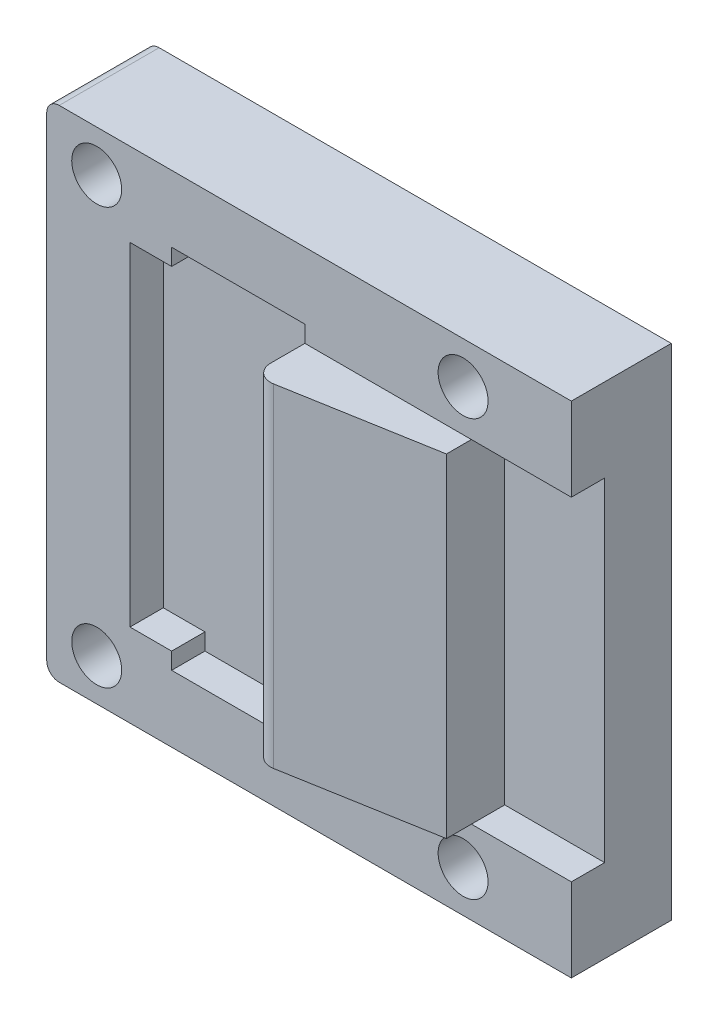
ISO-10303-21;
HEADER;
FILE_DESCRIPTION(('STEP AP214'),'2;1');
FILE_NAME('part.step','',(''),(''),'','','');
FILE_SCHEMA(('AUTOMOTIVE_DESIGN { 1 0 10303 214 1 1 1 1 }'));
ENDSEC;
DATA;
#1=APPLICATION_CONTEXT('core data for automotive mechanical design processes');
#2=APPLICATION_PROTOCOL_DEFINITION('international standard','automotive_design',2000,#1);
#3=PRODUCT_CONTEXT('',#1,'mechanical');
#4=PRODUCT('Part','Part','',(#3));
#5=PRODUCT_RELATED_PRODUCT_CATEGORY('part','',(#4));
#6=PRODUCT_DEFINITION_FORMATION('','',#4);
#7=PRODUCT_DEFINITION_CONTEXT('part definition',#1,'design');
#8=PRODUCT_DEFINITION('design','',#6,#7);
#9=PRODUCT_DEFINITION_SHAPE('','',#8);
#10=(LENGTH_UNIT() NAMED_UNIT(*) SI_UNIT(.MILLI.,.METRE.));
#11=(NAMED_UNIT(*) PLANE_ANGLE_UNIT() SI_UNIT($,.RADIAN.));
#12=(NAMED_UNIT(*) SI_UNIT($,.STERADIAN.) SOLID_ANGLE_UNIT());
#13=UNCERTAINTY_MEASURE_WITH_UNIT(LENGTH_MEASURE(1.E-05),#10,'distance_accuracy_value','');
#14=(GEOMETRIC_REPRESENTATION_CONTEXT(3) GLOBAL_UNCERTAINTY_ASSIGNED_CONTEXT((#13)) GLOBAL_UNIT_ASSIGNED_CONTEXT((#10,
#11,#12)) REPRESENTATION_CONTEXT('',''));
#15=CARTESIAN_POINT('',(0.,0.,0.));
#16=DIRECTION('',(0.,0.,1.));
#17=DIRECTION('',(1.,0.,0.));
#18=AXIS2_PLACEMENT_3D('',#15,#16,#17);
#19=CARTESIAN_POINT('',(-19.25,-14.25,6.));
#20=DIRECTION('',(0.,0.,1.));
#21=DIRECTION('',(0.,-1.,0.));
#22=AXIS2_PLACEMENT_3D('',#19,#20,#21);
#23=CYLINDRICAL_SURFACE('',#22,0.75);
#24=DIRECTION('',(0.,0.,1.));
#25=VECTOR('',#24,1.);
#26=CARTESIAN_POINT('',(-20.,-14.25,6.));
#27=LINE('',#26,#25);
#28=CARTESIAN_POINT('',(-20.,-14.25,0.));
#29=VERTEX_POINT('',#28);
#30=CARTESIAN_POINT('',(-20.,-14.25,6.));
#31=VERTEX_POINT('',#30);
#32=EDGE_CURVE('E265',#29,#31,#27,.T.);
#33=ORIENTED_EDGE('',*,*,#32,.F.);
#34=CARTESIAN_POINT('',(-19.25,-14.25,0.));
#35=DIRECTION('',(0.,0.,1.));
#36=DIRECTION('',(1.,0.,0.));
#37=AXIS2_PLACEMENT_3D('',#34,#35,#36);
#38=CIRCLE('',#37,0.75);
#39=CARTESIAN_POINT('',(-19.25,-15.,0.));
#40=VERTEX_POINT('',#39);
#41=EDGE_CURVE('E271',#40,#29,#38,.F.);
#42=ORIENTED_EDGE('',*,*,#41,.F.);
#43=DIRECTION('',(0.,0.,1.));
#44=VECTOR('',#43,1.);
#45=CARTESIAN_POINT('',(-19.25,-15.,6.));
#46=LINE('',#45,#44);
#47=CARTESIAN_POINT('',(-19.25,-15.,6.));
#48=VERTEX_POINT('',#47);
#49=EDGE_CURVE('E268',#48,#40,#46,.F.);
#50=ORIENTED_EDGE('',*,*,#49,.F.);
#51=CARTESIAN_POINT('',(-19.25,-14.25,6.));
#52=DIRECTION('',(0.,0.,-1.));
#53=DIRECTION('',(0.,1.,0.));
#54=AXIS2_PLACEMENT_3D('',#51,#52,#53);
#55=CIRCLE('',#54,0.75);
#56=EDGE_CURVE('E41',#31,#48,#55,.F.);
#57=ORIENTED_EDGE('',*,*,#56,.F.);
#58=EDGE_LOOP('',(#33,#42,#50,#57));
#59=FACE_BOUND('',#58,.T.);
#60=ADVANCED_FACE('F34',(#59),#23,.T.);
#61=CARTESIAN_POINT('',(-19.25,14.25,6.));
#62=DIRECTION('',(0.,0.,1.));
#63=DIRECTION('',(0.,-1.,0.));
#64=AXIS2_PLACEMENT_3D('',#61,#62,#63);
#65=CYLINDRICAL_SURFACE('',#64,0.75);
#66=DIRECTION('',(0.,0.,1.));
#67=VECTOR('',#66,1.);
#68=CARTESIAN_POINT('',(-19.25,15.,6.));
#69=LINE('',#68,#67);
#70=CARTESIAN_POINT('',(-19.25,15.,0.));
#71=VERTEX_POINT('',#70);
#72=CARTESIAN_POINT('',(-19.25,15.,6.));
#73=VERTEX_POINT('',#72);
#74=EDGE_CURVE('E256',#71,#73,#69,.T.);
#75=ORIENTED_EDGE('',*,*,#74,.F.);
#76=CARTESIAN_POINT('',(-19.25,14.25,0.));
#77=DIRECTION('',(0.,0.,1.));
#78=DIRECTION('',(1.,0.,0.));
#79=AXIS2_PLACEMENT_3D('',#76,#77,#78);
#80=CIRCLE('',#79,0.75);
#81=CARTESIAN_POINT('',(-20.,14.25,0.));
#82=VERTEX_POINT('',#81);
#83=EDGE_CURVE('E227',#82,#71,#80,.F.);
#84=ORIENTED_EDGE('',*,*,#83,.F.);
#85=DIRECTION('',(0.,0.,1.));
#86=VECTOR('',#85,1.);
#87=CARTESIAN_POINT('',(-20.,14.25,6.));
#88=LINE('',#87,#86);
#89=CARTESIAN_POINT('',(-20.,14.25,6.));
#90=VERTEX_POINT('',#89);
#91=EDGE_CURVE('E258',#90,#82,#88,.F.);
#92=ORIENTED_EDGE('',*,*,#91,.F.);
#93=CARTESIAN_POINT('',(-19.25,14.25,6.));
#94=DIRECTION('',(0.,0.,-1.));
#95=DIRECTION('',(0.,1.,0.));
#96=AXIS2_PLACEMENT_3D('',#93,#94,#95);
#97=CIRCLE('',#96,0.75);
#98=EDGE_CURVE('E262',#73,#90,#97,.F.);
#99=ORIENTED_EDGE('',*,*,#98,.F.);
#100=EDGE_LOOP('',(#75,#84,#92,#99));
#101=FACE_BOUND('',#100,.T.);
#102=ADVANCED_FACE('F429',(#101),#65,.T.);
#103=CARTESIAN_POINT('',(-3.5,-20.1519702521235,8.05980297478765));
#104=DIRECTION('',(0.,1.,0.));
#105=DIRECTION('',(0.,0.,1.));
#106=AXIS2_PLACEMENT_3D('',#103,#104,#105);
#107=CYLINDRICAL_SURFACE('',#106,1.);
#108=DIRECTION('',(0.,-1.,0.));
#109=VECTOR('',#108,1.);
#110=CARTESIAN_POINT('',(-3.32761966824775,-20.1519702521235,9.04483344194336));
#111=LINE('',#110,#109);
#112=CARTESIAN_POINT('',(-3.32761966824775,10.,9.04483344194336));
#113=VERTEX_POINT('',#112);
#114=CARTESIAN_POINT('',(-3.32761966824775,-10.,9.04483344194336));
#115=VERTEX_POINT('',#114);
#116=EDGE_CURVE('E242',#113,#115,#111,.T.);
#117=ORIENTED_EDGE('',*,*,#116,.F.);
#118=CARTESIAN_POINT('',(-3.5,10.,8.05980297478765));
#119=DIRECTION('',(0.,-1.,0.));
#120=DIRECTION('',(0.,0.,-1.));
#121=AXIS2_PLACEMENT_3D('',#118,#119,#120);
#122=CIRCLE('',#121,1.);
#123=CARTESIAN_POINT('',(-4.5,10.,8.05980297478765));
#124=VERTEX_POINT('',#123);
#125=EDGE_CURVE('E252',#124,#113,#122,.F.);
#126=ORIENTED_EDGE('',*,*,#125,.F.);
#127=DIRECTION('',(0.,-1.,0.));
#128=VECTOR('',#127,1.);
#129=CARTESIAN_POINT('',(-4.5,-20.1519702521235,8.05980297478765));
#130=LINE('',#129,#128);
#131=CARTESIAN_POINT('',(-4.5,-10.,8.05980297478765));
#132=VERTEX_POINT('',#131);
#133=EDGE_CURVE('E249',#132,#124,#130,.F.);
#134=ORIENTED_EDGE('',*,*,#133,.F.);
#135=CARTESIAN_POINT('',(-3.5,-10.,8.05980297478765));
#136=DIRECTION('',(0.,1.,0.));
#137=DIRECTION('',(-1.,0.,0.));
#138=AXIS2_PLACEMENT_3D('',#135,#136,#137);
#139=CIRCLE('',#138,1.);
#140=EDGE_CURVE('E254',#115,#132,#139,.F.);
#141=ORIENTED_EDGE('',*,*,#140,.F.);
#142=EDGE_LOOP('',(#117,#126,#134,#141));
#143=FACE_BOUND('',#142,.T.);
#144=ADVANCED_FACE('F462',(#143),#107,.T.);
#145=CARTESIAN_POINT('',(15.,-10.,6.));
#146=DIRECTION('',(0.,1.,0.));
#147=DIRECTION('',(-1.,0.,0.));
#148=AXIS2_PLACEMENT_3D('',#145,#146,#147);
#149=PLANE('',#148);
#150=DIRECTION('',(0.,0.,1.));
#151=VECTOR('',#150,1.);
#152=CARTESIAN_POINT('',(-12.5,-10.,6.));
#153=LINE('',#152,#151);
#154=CARTESIAN_POINT('',(-12.5,-10.,4.));
#155=VERTEX_POINT('',#154);
#156=CARTESIAN_POINT('',(-12.5,-10.,6.));
#157=VERTEX_POINT('',#156);
#158=EDGE_CURVE('E346',#155,#157,#153,.T.);
#159=ORIENTED_EDGE('',*,*,#158,.F.);
#160=DIRECTION('',(1.,0.,0.));
#161=VECTOR('',#160,1.);
#162=CARTESIAN_POINT('',(-15.,-10.,4.));
#163=LINE('',#162,#161);
#164=CARTESIAN_POINT('',(-15.,-10.,4.));
#165=VERTEX_POINT('',#164);
#166=EDGE_CURVE('E388',#165,#155,#163,.T.);
#167=ORIENTED_EDGE('',*,*,#166,.F.);
#168=DIRECTION('',(0.,0.,-1.));
#169=VECTOR('',#168,1.);
#170=CARTESIAN_POINT('',(-15.,-10.,6.));
#171=LINE('',#170,#169);
#172=CARTESIAN_POINT('',(-15.,-10.,6.));
#173=VERTEX_POINT('',#172);
#174=EDGE_CURVE('E239',#173,#165,#171,.T.);
#175=ORIENTED_EDGE('',*,*,#174,.F.);
#176=DIRECTION('',(1.,0.,0.));
#177=VECTOR('',#176,1.);
#178=CARTESIAN_POINT('',(15.,-10.,6.));
#179=LINE('',#178,#177);
#180=EDGE_CURVE('E246',#173,#157,#179,.T.);
#181=ORIENTED_EDGE('',*,*,#180,.T.);
#182=EDGE_LOOP('',(#159,#167,#175,#181));
#183=FACE_BOUND('',#182,.T.);
#184=ADVANCED_FACE('F481',(#183),#149,.T.);
#185=DIRECTION('',(0.,0.,1.));
#186=VECTOR('',#185,1.);
#187=CARTESIAN_POINT('',(11.5,-10.,6.));
#188=LINE('',#187,#186);
#189=CARTESIAN_POINT('',(11.5,-10.,4.));
#190=VERTEX_POINT('',#189);
#191=CARTESIAN_POINT('',(11.5,-10.,6.));
#192=VERTEX_POINT('',#191);
#193=EDGE_CURVE('E434',#190,#192,#188,.T.);
#194=ORIENTED_EDGE('',*,*,#193,.F.);
#195=DIRECTION('',(1.,0.,0.));
#196=VECTOR('',#195,1.);
#197=CARTESIAN_POINT('',(5.5,-10.,4.));
#198=LINE('',#197,#196);
#199=CARTESIAN_POINT('',(5.5,-10.,4.));
#200=VERTEX_POINT('',#199);
#201=EDGE_CURVE('E378',#200,#190,#198,.T.);
#202=ORIENTED_EDGE('',*,*,#201,.F.);
#203=DIRECTION('',(0.,0.,-1.));
#204=VECTOR('',#203,1.);
#205=CARTESIAN_POINT('',(5.5,-10.,31.3606797749979));
#206=LINE('',#205,#204);
#207=CARTESIAN_POINT('',(5.5,-10.,6.));
#208=VERTEX_POINT('',#207);
#209=EDGE_CURVE('E387',#208,#200,#206,.T.);
#210=ORIENTED_EDGE('',*,*,#209,.F.);
#211=EDGE_CURVE('E419',#208,#192,#179,.T.);
#212=ORIENTED_EDGE('',*,*,#211,.T.);
#213=EDGE_LOOP('',(#194,#202,#210,#212));
#214=FACE_BOUND('',#213,.T.);
#215=ADVANCED_FACE('F443',(#214),#149,.T.);
#216=CARTESIAN_POINT('',(15.,10.,6.));
#217=DIRECTION('',(0.,-1.,0.));
#218=DIRECTION('',(1.,0.,0.));
#219=AXIS2_PLACEMENT_3D('',#216,#217,#218);
#220=PLANE('',#219);
#221=DIRECTION('',(0.,0.,-1.));
#222=VECTOR('',#221,1.);
#223=CARTESIAN_POINT('',(-12.5,9.99999999999999,6.));
#224=LINE('',#223,#222);
#225=CARTESIAN_POINT('',(-12.5,9.99999999999999,6.));
#226=VERTEX_POINT('',#225);
#227=CARTESIAN_POINT('',(-12.5,10.,4.));
#228=VERTEX_POINT('',#227);
#229=EDGE_CURVE('E344',#226,#228,#224,.T.);
#230=ORIENTED_EDGE('',*,*,#229,.F.);
#231=DIRECTION('',(-1.,0.,0.));
#232=VECTOR('',#231,1.);
#233=CARTESIAN_POINT('',(15.,10.,6.));
#234=LINE('',#233,#232);
#235=CARTESIAN_POINT('',(-15.,9.99999999999999,6.));
#236=VERTEX_POINT('',#235);
#237=EDGE_CURVE('E412',#226,#236,#234,.T.);
#238=ORIENTED_EDGE('',*,*,#237,.T.);
#239=DIRECTION('',(0.,0.,-1.));
#240=VECTOR('',#239,1.);
#241=CARTESIAN_POINT('',(-15.,9.99999999999999,6.));
#242=LINE('',#241,#240);
#243=CARTESIAN_POINT('',(-15.,10.,4.));
#244=VERTEX_POINT('',#243);
#245=EDGE_CURVE('E243',#236,#244,#242,.T.);
#246=ORIENTED_EDGE('',*,*,#245,.T.);
#247=DIRECTION('',(-1.,0.,0.));
#248=VECTOR('',#247,1.);
#249=CARTESIAN_POINT('',(-15.,10.,4.));
#250=LINE('',#249,#248);
#251=EDGE_CURVE('E381',#228,#244,#250,.T.);
#252=ORIENTED_EDGE('',*,*,#251,.F.);
#253=EDGE_LOOP('',(#230,#238,#246,#252));
#254=FACE_BOUND('',#253,.T.);
#255=ADVANCED_FACE('F493',(#254),#220,.T.);
#256=DIRECTION('',(0.,0.,-1.));
#257=VECTOR('',#256,1.);
#258=CARTESIAN_POINT('',(11.5,10.,6.));
#259=LINE('',#258,#257);
#260=CARTESIAN_POINT('',(11.5,10.,6.));
#261=VERTEX_POINT('',#260);
#262=CARTESIAN_POINT('',(11.5,10.,4.));
#263=VERTEX_POINT('',#262);
#264=EDGE_CURVE('E47',#261,#263,#259,.T.);
#265=ORIENTED_EDGE('',*,*,#264,.F.);
#266=CARTESIAN_POINT('',(5.5,10.,6.));
#267=VERTEX_POINT('',#266);
#268=EDGE_CURVE('E413',#261,#267,#234,.T.);
#269=ORIENTED_EDGE('',*,*,#268,.T.);
#270=DIRECTION('',(0.,0.,-1.));
#271=VECTOR('',#270,1.);
#272=CARTESIAN_POINT('',(5.5,10.,31.3606797749979));
#273=LINE('',#272,#271);
#274=CARTESIAN_POINT('',(5.5,10.,4.));
#275=VERTEX_POINT('',#274);
#276=EDGE_CURVE('E407',#267,#275,#273,.T.);
#277=ORIENTED_EDGE('',*,*,#276,.T.);
#278=DIRECTION('',(-1.,0.,0.));
#279=VECTOR('',#278,1.);
#280=CARTESIAN_POINT('',(5.5,10.,4.));
#281=LINE('',#280,#279);
#282=EDGE_CURVE('E376',#263,#275,#281,.T.);
#283=ORIENTED_EDGE('',*,*,#282,.F.);
#284=EDGE_LOOP('',(#265,#269,#277,#283));
#285=FACE_BOUND('',#284,.T.);
#286=ADVANCED_FACE('F503',(#285),#220,.T.);
#287=CARTESIAN_POINT('',(0.,0.,0.));
#288=DIRECTION('',(0.,0.,1.));
#289=DIRECTION('',(1.,0.,0.));
#290=AXIS2_PLACEMENT_3D('',#287,#288,#289);
#291=PLANE('',#290);
#292=CARTESIAN_POINT('',(-17.,12.5,0.));
#293=DIRECTION('',(0.,0.,1.));
#294=DIRECTION('',(1.,0.,0.));
#295=AXIS2_PLACEMENT_3D('',#292,#293,#294);
#296=CIRCLE('',#295,1.5);
#297=CARTESIAN_POINT('',(-15.5,12.5,0.));
#298=VERTEX_POINT('',#297);
#299=EDGE_CURVE('E351',#298,#298,#296,.F.);
#300=ORIENTED_EDGE('',*,*,#299,.F.);
#301=EDGE_LOOP('',(#300));
#302=FACE_BOUND('',#301,.T.);
#303=CARTESIAN_POINT('',(5.,12.5,0.));
#304=DIRECTION('',(0.,0.,1.));
#305=DIRECTION('',(1.,0.,0.));
#306=AXIS2_PLACEMENT_3D('',#303,#304,#305);
#307=CIRCLE('',#306,1.5);
#308=CARTESIAN_POINT('',(6.5,12.5,0.));
#309=VERTEX_POINT('',#308);
#310=EDGE_CURVE('E357',#309,#309,#307,.F.);
#311=ORIENTED_EDGE('',*,*,#310,.F.);
#312=EDGE_LOOP('',(#311));
#313=FACE_BOUND('',#312,.T.);
#314=CARTESIAN_POINT('',(5.,-12.5,0.));
#315=DIRECTION('',(0.,0.,1.));
#316=DIRECTION('',(1.,0.,0.));
#317=AXIS2_PLACEMENT_3D('',#314,#315,#316);
#318=CIRCLE('',#317,1.5);
#319=CARTESIAN_POINT('',(6.5,-12.5,0.));
#320=VERTEX_POINT('',#319);
#321=EDGE_CURVE('E363',#320,#320,#318,.F.);
#322=ORIENTED_EDGE('',*,*,#321,.F.);
#323=EDGE_LOOP('',(#322));
#324=FACE_BOUND('',#323,.T.);
#325=CARTESIAN_POINT('',(-17.,-12.5,0.));
#326=DIRECTION('',(0.,0.,1.));
#327=DIRECTION('',(1.,0.,0.));
#328=AXIS2_PLACEMENT_3D('',#325,#326,#327);
#329=CIRCLE('',#328,1.5);
#330=CARTESIAN_POINT('',(-15.5,-12.5,0.));
#331=VERTEX_POINT('',#330);
#332=EDGE_CURVE('E369',#331,#331,#329,.F.);
#333=ORIENTED_EDGE('',*,*,#332,.F.);
#334=EDGE_LOOP('',(#333));
#335=FACE_BOUND('',#334,.T.);
#336=DIRECTION('',(1.,0.,0.));
#337=VECTOR('',#336,1.);
#338=CARTESIAN_POINT('',(15.,15.,0.));
#339=LINE('',#338,#337);
#340=CARTESIAN_POINT('',(11.5,15.,0.));
#341=VERTEX_POINT('',#340);
#342=EDGE_CURVE('E220',#71,#341,#339,.T.);
#343=ORIENTED_EDGE('',*,*,#342,.T.);
#344=DIRECTION('',(0.,-1.,0.));
#345=VECTOR('',#344,1.);
#346=CARTESIAN_POINT('',(11.5,18.8406798442315,0.));
#347=LINE('',#346,#345);
#348=CARTESIAN_POINT('',(11.5,-15.,0.));
#349=VERTEX_POINT('',#348);
#350=EDGE_CURVE('E204',#341,#349,#347,.T.);
#351=ORIENTED_EDGE('',*,*,#350,.T.);
#352=DIRECTION('',(-1.,0.,0.));
#353=VECTOR('',#352,1.);
#354=CARTESIAN_POINT('',(15.,-15.,0.));
#355=LINE('',#354,#353);
#356=EDGE_CURVE('E284',#349,#40,#355,.T.);
#357=ORIENTED_EDGE('',*,*,#356,.T.);
#358=ORIENTED_EDGE('',*,*,#41,.T.);
#359=DIRECTION('',(0.,1.,0.));
#360=VECTOR('',#359,1.);
#361=CARTESIAN_POINT('',(-20.,15.,0.));
#362=LINE('',#361,#360);
#363=CARTESIAN_POINT('',(-20.,-2.5,0.));
#364=VERTEX_POINT('',#363);
#365=EDGE_CURVE('E230',#29,#364,#362,.T.);
#366=ORIENTED_EDGE('',*,*,#365,.T.);
#367=DIRECTION('',(-1.,0.,0.));
#368=VECTOR('',#367,1.);
#369=CARTESIAN_POINT('',(7.49999999999999,-2.5,0.));
#370=LINE('',#369,#368);
#371=CARTESIAN_POINT('',(7.49999999999999,-2.5,0.));
#372=VERTEX_POINT('',#371);
#373=EDGE_CURVE('E303',#372,#364,#370,.T.);
#374=ORIENTED_EDGE('',*,*,#373,.F.);
#375=DIRECTION('',(0.,-1.,0.));
#376=VECTOR('',#375,1.);
#377=CARTESIAN_POINT('',(7.49999999999999,-2.5,0.));
#378=LINE('',#377,#376);
#379=CARTESIAN_POINT('',(7.5,2.5,0.));
#380=VERTEX_POINT('',#379);
#381=EDGE_CURVE('E223',#380,#372,#378,.T.);
#382=ORIENTED_EDGE('',*,*,#381,.F.);
#383=DIRECTION('',(1.,0.,0.));
#384=VECTOR('',#383,1.);
#385=CARTESIAN_POINT('',(7.5,2.5,0.));
#386=LINE('',#385,#384);
#387=CARTESIAN_POINT('',(-20.,2.5,0.));
#388=VERTEX_POINT('',#387);
#389=EDGE_CURVE('E293',#388,#380,#386,.T.);
#390=ORIENTED_EDGE('',*,*,#389,.F.);
#391=EDGE_CURVE('E235',#388,#82,#362,.T.);
#392=ORIENTED_EDGE('',*,*,#391,.T.);
#393=ORIENTED_EDGE('',*,*,#83,.T.);
#394=EDGE_LOOP('',(#343,#351,#357,#358,#366,#374,#382,#390,#392,#393));
#395=FACE_BOUND('',#394,.T.);
#396=ADVANCED_FACE('F225',(#302,#313,#324,#335,#395),#291,.F.);
#397=CARTESIAN_POINT('',(-15.,9.99999999999999,6.));
#398=DIRECTION('',(1.,0.,0.));
#399=DIRECTION('',(0.,0.,-1.));
#400=AXIS2_PLACEMENT_3D('',#397,#398,#399);
#401=PLANE('',#400);
#402=DIRECTION('',(0.,-1.,0.));
#403=VECTOR('',#402,1.);
#404=CARTESIAN_POINT('',(-15.,-10.,4.));
#405=LINE('',#404,#403);
#406=EDGE_CURVE('E391',#244,#165,#405,.T.);
#407=ORIENTED_EDGE('',*,*,#406,.F.);
#408=ORIENTED_EDGE('',*,*,#245,.F.);
#409=DIRECTION('',(0.,-1.,0.));
#410=VECTOR('',#409,1.);
#411=CARTESIAN_POINT('',(-15.,9.99999999999999,6.));
#412=LINE('',#411,#410);
#413=EDGE_CURVE('E415',#236,#173,#412,.T.);
#414=ORIENTED_EDGE('',*,*,#413,.T.);
#415=ORIENTED_EDGE('',*,*,#174,.T.);
#416=EDGE_LOOP('',(#407,#408,#414,#415));
#417=FACE_BOUND('',#416,.T.);
#418=ADVANCED_FACE('F489',(#417),#401,.T.);
#419=CARTESIAN_POINT('',(15.,15.,6.));
#420=DIRECTION('',(0.,1.,0.));
#421=DIRECTION('',(-1.,0.,0.));
#422=AXIS2_PLACEMENT_3D('',#419,#420,#421);
#423=PLANE('',#422);
#424=DIRECTION('',(0.,0.,1.));
#425=VECTOR('',#424,1.);
#426=CARTESIAN_POINT('',(11.5,15.,6.));
#427=LINE('',#426,#425);
#428=CARTESIAN_POINT('',(11.5,15.,6.));
#429=VERTEX_POINT('',#428);
#430=EDGE_CURVE('E207',#341,#429,#427,.T.);
#431=ORIENTED_EDGE('',*,*,#430,.F.);
#432=ORIENTED_EDGE('',*,*,#342,.F.);
#433=ORIENTED_EDGE('',*,*,#74,.T.);
#434=DIRECTION('',(1.,0.,0.));
#435=VECTOR('',#434,1.);
#436=CARTESIAN_POINT('',(15.,15.,6.));
#437=LINE('',#436,#435);
#438=EDGE_CURVE('E222',#73,#429,#437,.T.);
#439=ORIENTED_EDGE('',*,*,#438,.T.);
#440=EDGE_LOOP('',(#431,#432,#433,#439));
#441=FACE_BOUND('',#440,.T.);
#442=ADVANCED_FACE('F218',(#441),#423,.T.);
#443=CARTESIAN_POINT('',(-20.,15.,6.));
#444=DIRECTION('',(-1.,0.,0.));
#445=DIRECTION('',(0.,0.,1.));
#446=AXIS2_PLACEMENT_3D('',#443,#444,#445);
#447=PLANE('',#446);
#448=DIRECTION('',(0.,0.,-1.));
#449=VECTOR('',#448,1.);
#450=CARTESIAN_POINT('',(-20.,2.5,2.));
#451=LINE('',#450,#449);
#452=CARTESIAN_POINT('',(-20.,2.5,2.));
#453=VERTEX_POINT('',#452);
#454=EDGE_CURVE('E310',#453,#388,#451,.T.);
#455=ORIENTED_EDGE('',*,*,#454,.F.);
#456=DIRECTION('',(0.,1.,0.));
#457=VECTOR('',#456,1.);
#458=CARTESIAN_POINT('',(-20.,-2.5,2.));
#459=LINE('',#458,#457);
#460=CARTESIAN_POINT('',(-20.,-2.5,2.));
#461=VERTEX_POINT('',#460);
#462=EDGE_CURVE('E295',#461,#453,#459,.T.);
#463=ORIENTED_EDGE('',*,*,#462,.F.);
#464=DIRECTION('',(0.,0.,-1.));
#465=VECTOR('',#464,1.);
#466=CARTESIAN_POINT('',(-20.,-2.5,2.));
#467=LINE('',#466,#465);
#468=EDGE_CURVE('E312',#461,#364,#467,.T.);
#469=ORIENTED_EDGE('',*,*,#468,.T.);
#470=ORIENTED_EDGE('',*,*,#365,.F.);
#471=ORIENTED_EDGE('',*,*,#32,.T.);
#472=DIRECTION('',(0.,1.,0.));
#473=VECTOR('',#472,1.);
#474=CARTESIAN_POINT('',(-20.,15.,6.));
#475=LINE('',#474,#473);
#476=EDGE_CURVE('E232',#31,#90,#475,.T.);
#477=ORIENTED_EDGE('',*,*,#476,.T.);
#478=ORIENTED_EDGE('',*,*,#91,.T.);
#479=ORIENTED_EDGE('',*,*,#391,.F.);
#480=EDGE_LOOP('',(#455,#463,#469,#470,#471,#477,#478,#479));
#481=FACE_BOUND('',#480,.T.);
#482=ADVANCED_FACE('F430',(#481),#447,.T.);
#483=CARTESIAN_POINT('',(15.,-15.,6.));
#484=DIRECTION('',(0.,-1.,0.));
#485=DIRECTION('',(1.,0.,0.));
#486=AXIS2_PLACEMENT_3D('',#483,#484,#485);
#487=PLANE('',#486);
#488=DIRECTION('',(0.,0.,-1.));
#489=VECTOR('',#488,1.);
#490=CARTESIAN_POINT('',(11.5,-15.,6.));
#491=LINE('',#490,#489);
#492=CARTESIAN_POINT('',(11.5,-15.,6.));
#493=VERTEX_POINT('',#492);
#494=EDGE_CURVE('E210',#493,#349,#491,.T.);
#495=ORIENTED_EDGE('',*,*,#494,.F.);
#496=DIRECTION('',(-1.,0.,0.));
#497=VECTOR('',#496,1.);
#498=CARTESIAN_POINT('',(15.,-15.,6.));
#499=LINE('',#498,#497);
#500=EDGE_CURVE('E229',#493,#48,#499,.T.);
#501=ORIENTED_EDGE('',*,*,#500,.T.);
#502=ORIENTED_EDGE('',*,*,#49,.T.);
#503=ORIENTED_EDGE('',*,*,#356,.F.);
#504=EDGE_LOOP('',(#495,#501,#502,#503));
#505=FACE_BOUND('',#504,.T.);
#506=ADVANCED_FACE('F283',(#505),#487,.T.);
#507=CARTESIAN_POINT('',(0.,0.,6.));
#508=DIRECTION('',(0.,0.,-1.));
#509=DIRECTION('',(0.,1.,0.));
#510=AXIS2_PLACEMENT_3D('',#507,#508,#509);
#511=PLANE('',#510);
#512=CARTESIAN_POINT('',(-17.,12.5,6.));
#513=DIRECTION('',(0.,0.,1.));
#514=DIRECTION('',(-1.,0.,0.));
#515=AXIS2_PLACEMENT_3D('',#512,#513,#514);
#516=CIRCLE('',#515,1.5);
#517=CARTESIAN_POINT('',(-18.5,12.5,6.));
#518=VERTEX_POINT('',#517);
#519=EDGE_CURVE('E348',#518,#518,#516,.T.);
#520=ORIENTED_EDGE('',*,*,#519,.F.);
#521=EDGE_LOOP('',(#520));
#522=FACE_BOUND('',#521,.T.);
#523=CARTESIAN_POINT('',(5.,12.5,6.));
#524=DIRECTION('',(0.,0.,1.));
#525=DIRECTION('',(-1.,0.,0.));
#526=AXIS2_PLACEMENT_3D('',#523,#524,#525);
#527=CIRCLE('',#526,1.5);
#528=CARTESIAN_POINT('',(3.5,12.5,6.));
#529=VERTEX_POINT('',#528);
#530=EDGE_CURVE('E354',#529,#529,#527,.T.);
#531=ORIENTED_EDGE('',*,*,#530,.F.);
#532=EDGE_LOOP('',(#531));
#533=FACE_BOUND('',#532,.T.);
#534=CARTESIAN_POINT('',(5.,-12.5,6.));
#535=DIRECTION('',(0.,0.,1.));
#536=DIRECTION('',(1.,0.,0.));
#537=AXIS2_PLACEMENT_3D('',#534,#535,#536);
#538=CIRCLE('',#537,1.5);
#539=CARTESIAN_POINT('',(6.5,-12.5,6.));
#540=VERTEX_POINT('',#539);
#541=EDGE_CURVE('E360',#540,#540,#538,.T.);
#542=ORIENTED_EDGE('',*,*,#541,.F.);
#543=EDGE_LOOP('',(#542));
#544=FACE_BOUND('',#543,.T.);
#545=CARTESIAN_POINT('',(-17.,-12.5,6.));
#546=DIRECTION('',(0.,0.,1.));
#547=DIRECTION('',(1.,0.,0.));
#548=AXIS2_PLACEMENT_3D('',#545,#546,#547);
#549=CIRCLE('',#548,1.5);
#550=CARTESIAN_POINT('',(-15.5,-12.5,6.));
#551=VERTEX_POINT('',#550);
#552=EDGE_CURVE('E366',#551,#551,#549,.T.);
#553=ORIENTED_EDGE('',*,*,#552,.F.);
#554=EDGE_LOOP('',(#553));
#555=FACE_BOUND('',#554,.T.);
#556=ORIENTED_EDGE('',*,*,#500,.F.);
#557=DIRECTION('',(0.,1.,0.));
#558=VECTOR('',#557,1.);
#559=CARTESIAN_POINT('',(11.5,0.,6.));
#560=LINE('',#559,#558);
#561=EDGE_CURVE('E285',#493,#192,#560,.T.);
#562=ORIENTED_EDGE('',*,*,#561,.T.);
#563=ORIENTED_EDGE('',*,*,#211,.F.);
#564=CARTESIAN_POINT('',(-4.5,-10.,6.));
#565=VERTEX_POINT('',#564);
#566=EDGE_CURVE('E421',#565,#208,#179,.T.);
#567=ORIENTED_EDGE('',*,*,#566,.F.);
#568=DIRECTION('',(0.,1.,0.));
#569=VECTOR('',#568,1.);
#570=CARTESIAN_POINT('',(-4.5,11.,6.));
#571=LINE('',#570,#569);
#572=CARTESIAN_POINT('',(-4.5,-11.,6.));
#573=VERTEX_POINT('',#572);
#574=EDGE_CURVE('E330',#573,#565,#571,.T.);
#575=ORIENTED_EDGE('',*,*,#574,.F.);
#576=DIRECTION('',(1.,0.,0.));
#577=VECTOR('',#576,1.);
#578=CARTESIAN_POINT('',(-12.5,-11.,6.));
#579=LINE('',#578,#577);
#580=CARTESIAN_POINT('',(-12.5,-11.,6.));
#581=VERTEX_POINT('',#580);
#582=EDGE_CURVE('E326',#581,#573,#579,.T.);
#583=ORIENTED_EDGE('',*,*,#582,.F.);
#584=DIRECTION('',(0.,-1.,0.));
#585=VECTOR('',#584,1.);
#586=CARTESIAN_POINT('',(-12.5,11.,6.));
#587=LINE('',#586,#585);
#588=EDGE_CURVE('E309',#157,#581,#587,.T.);
#589=ORIENTED_EDGE('',*,*,#588,.F.);
#590=ORIENTED_EDGE('',*,*,#180,.F.);
#591=ORIENTED_EDGE('',*,*,#413,.F.);
#592=ORIENTED_EDGE('',*,*,#237,.F.);
#593=CARTESIAN_POINT('',(-12.5,11.,6.));
#594=VERTEX_POINT('',#593);
#595=EDGE_CURVE('E324',#594,#226,#587,.T.);
#596=ORIENTED_EDGE('',*,*,#595,.F.);
#597=DIRECTION('',(-1.,0.,0.));
#598=VECTOR('',#597,1.);
#599=CARTESIAN_POINT('',(-12.5,11.,6.));
#600=LINE('',#599,#598);
#601=CARTESIAN_POINT('',(-4.5,11.,6.));
#602=VERTEX_POINT('',#601);
#603=EDGE_CURVE('E332',#602,#594,#600,.T.);
#604=ORIENTED_EDGE('',*,*,#603,.F.);
#605=CARTESIAN_POINT('',(-4.5,10.,6.));
#606=VERTEX_POINT('',#605);
#607=EDGE_CURVE('E329',#606,#602,#571,.T.);
#608=ORIENTED_EDGE('',*,*,#607,.F.);
#609=EDGE_CURVE('E416',#267,#606,#234,.T.);
#610=ORIENTED_EDGE('',*,*,#609,.F.);
#611=ORIENTED_EDGE('',*,*,#268,.F.);
#612=EDGE_CURVE('E287',#261,#429,#560,.T.);
#613=ORIENTED_EDGE('',*,*,#612,.T.);
#614=ORIENTED_EDGE('',*,*,#438,.F.);
#615=ORIENTED_EDGE('',*,*,#98,.T.);
#616=ORIENTED_EDGE('',*,*,#476,.F.);
#617=ORIENTED_EDGE('',*,*,#56,.T.);
#618=EDGE_LOOP('',(#556,#562,#563,#567,#575,#583,#589,#590,#591,#592,#596,#604,#608,#610,#611,
#613,#614,#615,#616,#617));
#619=FACE_BOUND('',#618,.T.);
#620=ADVANCED_FACE('F277',(#522,#533,#544,#555,#619),#511,.F.);
#621=CARTESIAN_POINT('',(5.5,-10.,31.3606797749979));
#622=DIRECTION('',(0.,1.,0.));
#623=DIRECTION('',(-1.,0.,0.));
#624=AXIS2_PLACEMENT_3D('',#621,#622,#623);
#625=PLANE('',#624);
#626=DIRECTION('',(-0.985030467155704,0.,0.172380331752248));
#627=VECTOR('',#626,1.);
#628=CARTESIAN_POINT('',(-4.5,-10.,9.25));
#629=LINE('',#628,#627);
#630=CARTESIAN_POINT('',(5.5,-10.,7.5));
#631=VERTEX_POINT('',#630);
#632=EDGE_CURVE('E373',#631,#115,#629,.T.);
#633=ORIENTED_EDGE('',*,*,#632,.T.);
#634=ORIENTED_EDGE('',*,*,#140,.T.);
#635=DIRECTION('',(0.,0.,-1.));
#636=VECTOR('',#635,1.);
#637=CARTESIAN_POINT('',(-4.5,-10.,31.3606797749979));
#638=LINE('',#637,#636);
#639=EDGE_CURVE('E401',#132,#565,#638,.T.);
#640=ORIENTED_EDGE('',*,*,#639,.T.);
#641=ORIENTED_EDGE('',*,*,#566,.T.);
#642=EDGE_CURVE('E398',#631,#208,#206,.T.);
#643=ORIENTED_EDGE('',*,*,#642,.F.);
#644=EDGE_LOOP('',(#633,#634,#640,#641,#643));
#645=FACE_BOUND('',#644,.T.);
#646=ADVANCED_FACE('F447',(#645),#625,.F.);
#647=CARTESIAN_POINT('',(5.5,10.,31.3606797749979));
#648=DIRECTION('',(0.,-1.,0.));
#649=DIRECTION('',(0.,0.,-1.));
#650=AXIS2_PLACEMENT_3D('',#647,#648,#649);
#651=PLANE('',#650);
#652=DIRECTION('',(0.,0.,-1.));
#653=VECTOR('',#652,1.);
#654=CARTESIAN_POINT('',(-4.5,10.,31.3606797749979));
#655=LINE('',#654,#653);
#656=EDGE_CURVE('E404',#124,#606,#655,.T.);
#657=ORIENTED_EDGE('',*,*,#656,.F.);
#658=ORIENTED_EDGE('',*,*,#125,.T.);
#659=DIRECTION('',(0.985030467155704,0.,-0.172380331752248));
#660=VECTOR('',#659,1.);
#661=CARTESIAN_POINT('',(-4.5,10.,9.25));
#662=LINE('',#661,#660);
#663=CARTESIAN_POINT('',(5.5,10.,7.5));
#664=VERTEX_POINT('',#663);
#665=EDGE_CURVE('E372',#113,#664,#662,.T.);
#666=ORIENTED_EDGE('',*,*,#665,.T.);
#667=EDGE_CURVE('E397',#664,#267,#273,.T.);
#668=ORIENTED_EDGE('',*,*,#667,.T.);
#669=ORIENTED_EDGE('',*,*,#609,.T.);
#670=EDGE_LOOP('',(#657,#658,#666,#668,#669));
#671=FACE_BOUND('',#670,.T.);
#672=ADVANCED_FACE('F498',(#671),#651,.F.);
#673=CARTESIAN_POINT('',(-4.5,-10.,31.3606797749979));
#674=DIRECTION('',(1.,0.,0.));
#675=DIRECTION('',(0.,0.,-1.));
#676=AXIS2_PLACEMENT_3D('',#673,#674,#675);
#677=PLANE('',#676);
#678=ORIENTED_EDGE('',*,*,#656,.T.);
#679=ORIENTED_EDGE('',*,*,#607,.T.);
#680=DIRECTION('',(0.,0.,1.));
#681=VECTOR('',#680,1.);
#682=CARTESIAN_POINT('',(-4.5,11.,-19.4093998214393));
#683=LINE('',#682,#681);
#684=CARTESIAN_POINT('',(-4.5,11.,4.));
#685=VERTEX_POINT('',#684);
#686=EDGE_CURVE('E337',#685,#602,#683,.T.);
#687=ORIENTED_EDGE('',*,*,#686,.F.);
#688=DIRECTION('',(0.,1.,0.));
#689=VECTOR('',#688,1.);
#690=CARTESIAN_POINT('',(-4.5,-10.,4.));
#691=LINE('',#690,#689);
#692=CARTESIAN_POINT('',(-4.5,-11.,3.99999999999999));
#693=VERTEX_POINT('',#692);
#694=EDGE_CURVE('E385',#693,#685,#691,.T.);
#695=ORIENTED_EDGE('',*,*,#694,.F.);
#696=DIRECTION('',(0.,0.,1.));
#697=VECTOR('',#696,1.);
#698=CARTESIAN_POINT('',(-4.5,-11.,-19.4093998214393));
#699=LINE('',#698,#697);
#700=EDGE_CURVE('E340',#693,#573,#699,.T.);
#701=ORIENTED_EDGE('',*,*,#700,.T.);
#702=ORIENTED_EDGE('',*,*,#574,.T.);
#703=ORIENTED_EDGE('',*,*,#639,.F.);
#704=ORIENTED_EDGE('',*,*,#133,.T.);
#705=EDGE_LOOP('',(#678,#679,#687,#695,#701,#702,#703,#704));
#706=FACE_BOUND('',#705,.T.);
#707=ADVANCED_FACE('F465',(#706),#677,.F.);
#708=CARTESIAN_POINT('',(5.5,-10.,31.3606797749979));
#709=DIRECTION('',(-1.,0.,0.));
#710=DIRECTION('',(0.,0.,1.));
#711=AXIS2_PLACEMENT_3D('',#708,#709,#710);
#712=PLANE('',#711);
#713=ORIENTED_EDGE('',*,*,#209,.T.);
#714=DIRECTION('',(0.,-1.,0.));
#715=VECTOR('',#714,1.);
#716=CARTESIAN_POINT('',(5.5,10.,4.));
#717=LINE('',#716,#715);
#718=EDGE_CURVE('E382',#275,#200,#717,.T.);
#719=ORIENTED_EDGE('',*,*,#718,.F.);
#720=ORIENTED_EDGE('',*,*,#276,.F.);
#721=ORIENTED_EDGE('',*,*,#667,.F.);
#722=DIRECTION('',(0.,-1.,0.));
#723=VECTOR('',#722,1.);
#724=CARTESIAN_POINT('',(5.5,-10.,7.5));
#725=LINE('',#724,#723);
#726=EDGE_CURVE('E394',#664,#631,#725,.T.);
#727=ORIENTED_EDGE('',*,*,#726,.T.);
#728=ORIENTED_EDGE('',*,*,#642,.T.);
#729=EDGE_LOOP('',(#713,#719,#720,#721,#727,#728));
#730=FACE_BOUND('',#729,.T.);
#731=ADVANCED_FACE('F451',(#730),#712,.F.);
#732=CARTESIAN_POINT('',(0.,0.,4.));
#733=DIRECTION('',(0.,0.,1.));
#734=DIRECTION('',(1.,0.,0.));
#735=AXIS2_PLACEMENT_3D('',#732,#733,#734);
#736=PLANE('',#735);
#737=ORIENTED_EDGE('',*,*,#166,.T.);
#738=DIRECTION('',(0.,1.,0.));
#739=VECTOR('',#738,1.);
#740=CARTESIAN_POINT('',(-12.5,11.,4.));
#741=LINE('',#740,#739);
#742=CARTESIAN_POINT('',(-12.5,-11.,4.));
#743=VERTEX_POINT('',#742);
#744=EDGE_CURVE('E321',#743,#155,#741,.T.);
#745=ORIENTED_EDGE('',*,*,#744,.F.);
#746=DIRECTION('',(-1.,0.,0.));
#747=VECTOR('',#746,1.);
#748=CARTESIAN_POINT('',(-12.5,-11.,4.));
#749=LINE('',#748,#747);
#750=EDGE_CURVE('E323',#693,#743,#749,.T.);
#751=ORIENTED_EDGE('',*,*,#750,.F.);
#752=ORIENTED_EDGE('',*,*,#694,.T.);
#753=DIRECTION('',(1.,0.,0.));
#754=VECTOR('',#753,1.);
#755=CARTESIAN_POINT('',(-12.5,11.,4.));
#756=LINE('',#755,#754);
#757=CARTESIAN_POINT('',(-12.5,11.,4.));
#758=VERTEX_POINT('',#757);
#759=EDGE_CURVE('E316',#758,#685,#756,.T.);
#760=ORIENTED_EDGE('',*,*,#759,.F.);
#761=EDGE_CURVE('E319',#228,#758,#741,.T.);
#762=ORIENTED_EDGE('',*,*,#761,.F.);
#763=ORIENTED_EDGE('',*,*,#251,.T.);
#764=ORIENTED_EDGE('',*,*,#406,.T.);
#765=EDGE_LOOP('',(#737,#745,#751,#752,#760,#762,#763,#764));
#766=FACE_BOUND('',#765,.T.);
#767=ADVANCED_FACE('F483',(#766),#736,.T.);
#768=CARTESIAN_POINT('',(0.,0.,4.));
#769=DIRECTION('',(0.,0.,1.));
#770=DIRECTION('',(1.,0.,0.));
#771=AXIS2_PLACEMENT_3D('',#768,#769,#770);
#772=PLANE('',#771);
#773=DIRECTION('',(0.,-1.,0.));
#774=VECTOR('',#773,1.);
#775=CARTESIAN_POINT('',(11.5,0.,4.));
#776=LINE('',#775,#774);
#777=EDGE_CURVE('E12',#263,#190,#776,.T.);
#778=ORIENTED_EDGE('',*,*,#777,.F.);
#779=ORIENTED_EDGE('',*,*,#282,.T.);
#780=ORIENTED_EDGE('',*,*,#718,.T.);
#781=ORIENTED_EDGE('',*,*,#201,.T.);
#782=EDGE_LOOP('',(#778,#779,#780,#781));
#783=FACE_BOUND('',#782,.T.);
#784=ADVANCED_FACE('F505',(#783),#772,.T.);
#785=CARTESIAN_POINT('',(-4.5,-20.1519702521235,9.25));
#786=DIRECTION('',(0.172380331752248,0.,0.985030467155704));
#787=DIRECTION('',(0.985030467155704,0.,-0.172380331752248));
#788=AXIS2_PLACEMENT_3D('',#785,#786,#787);
#789=PLANE('',#788);
#790=ORIENTED_EDGE('',*,*,#665,.F.);
#791=ORIENTED_EDGE('',*,*,#116,.T.);
#792=ORIENTED_EDGE('',*,*,#632,.F.);
#793=ORIENTED_EDGE('',*,*,#726,.F.);
#794=EDGE_LOOP('',(#790,#791,#792,#793));
#795=FACE_BOUND('',#794,.T.);
#796=ADVANCED_FACE('F458',(#795),#789,.T.);
#797=CARTESIAN_POINT('',(-17.,-12.5,-4.24264068711929));
#798=DIRECTION('',(0.,0.,1.));
#799=DIRECTION('',(1.,0.,0.));
#800=AXIS2_PLACEMENT_3D('',#797,#798,#799);
#801=CYLINDRICAL_SURFACE('',#800,1.5);
#802=ORIENTED_EDGE('',*,*,#332,.T.);
#803=EDGE_LOOP('',(#802));
#804=FACE_BOUND('',#803,.T.);
#805=ORIENTED_EDGE('',*,*,#552,.T.);
#806=EDGE_LOOP('',(#805));
#807=FACE_BOUND('',#806,.T.);
#808=ADVANCED_FACE('F513',(#804,#807),#801,.F.);
#809=CARTESIAN_POINT('',(5.,-12.5,-4.24264068711929));
#810=DIRECTION('',(0.,0.,1.));
#811=DIRECTION('',(1.,0.,0.));
#812=AXIS2_PLACEMENT_3D('',#809,#810,#811);
#813=CYLINDRICAL_SURFACE('',#812,1.5);
#814=ORIENTED_EDGE('',*,*,#321,.T.);
#815=EDGE_LOOP('',(#814));
#816=FACE_BOUND('',#815,.T.);
#817=ORIENTED_EDGE('',*,*,#541,.T.);
#818=EDGE_LOOP('',(#817));
#819=FACE_BOUND('',#818,.T.);
#820=ADVANCED_FACE('F591',(#816,#819),#813,.F.);
#821=CARTESIAN_POINT('',(5.,12.5,-4.24264068711929));
#822=DIRECTION('',(0.,0.,1.));
#823=DIRECTION('',(1.,0.,0.));
#824=AXIS2_PLACEMENT_3D('',#821,#822,#823);
#825=CYLINDRICAL_SURFACE('',#824,1.5);
#826=ORIENTED_EDGE('',*,*,#310,.T.);
#827=EDGE_LOOP('',(#826));
#828=FACE_BOUND('',#827,.T.);
#829=ORIENTED_EDGE('',*,*,#530,.T.);
#830=EDGE_LOOP('',(#829));
#831=FACE_BOUND('',#830,.T.);
#832=ADVANCED_FACE('F599',(#828,#831),#825,.F.);
#833=CARTESIAN_POINT('',(-17.,12.5,-4.24264068711929));
#834=DIRECTION('',(0.,0.,1.));
#835=DIRECTION('',(1.,0.,0.));
#836=AXIS2_PLACEMENT_3D('',#833,#834,#835);
#837=CYLINDRICAL_SURFACE('',#836,1.5);
#838=ORIENTED_EDGE('',*,*,#299,.T.);
#839=EDGE_LOOP('',(#838));
#840=FACE_BOUND('',#839,.T.);
#841=ORIENTED_EDGE('',*,*,#519,.T.);
#842=EDGE_LOOP('',(#841));
#843=FACE_BOUND('',#842,.T.);
#844=ADVANCED_FACE('F607',(#840,#843),#837,.F.);
#845=CARTESIAN_POINT('',(-12.5,-11.,-19.4093998214393));
#846=DIRECTION('',(0.,-1.,0.));
#847=DIRECTION('',(1.,0.,0.));
#848=AXIS2_PLACEMENT_3D('',#845,#846,#847);
#849=PLANE('',#848);
#850=ORIENTED_EDGE('',*,*,#750,.T.);
#851=DIRECTION('',(0.,0.,1.));
#852=VECTOR('',#851,1.);
#853=CARTESIAN_POINT('',(-12.5,-11.,-19.4093998214393));
#854=LINE('',#853,#852);
#855=EDGE_CURVE('E335',#743,#581,#854,.T.);
#856=ORIENTED_EDGE('',*,*,#855,.T.);
#857=ORIENTED_EDGE('',*,*,#582,.T.);
#858=ORIENTED_EDGE('',*,*,#700,.F.);
#859=EDGE_LOOP('',(#850,#856,#857,#858));
#860=FACE_BOUND('',#859,.T.);
#861=ADVANCED_FACE('F472',(#860),#849,.F.);
#862=CARTESIAN_POINT('',(-12.5,11.,-19.4093998214393));
#863=DIRECTION('',(-1.,0.,0.));
#864=DIRECTION('',(0.,-1.,0.));
#865=AXIS2_PLACEMENT_3D('',#862,#863,#864);
#866=PLANE('',#865);
#867=ORIENTED_EDGE('',*,*,#158,.T.);
#868=ORIENTED_EDGE('',*,*,#588,.T.);
#869=ORIENTED_EDGE('',*,*,#855,.F.);
#870=ORIENTED_EDGE('',*,*,#744,.T.);
#871=EDGE_LOOP('',(#867,#868,#869,#870));
#872=FACE_BOUND('',#871,.T.);
#873=ADVANCED_FACE('F477',(#872),#866,.F.);
#874=ORIENTED_EDGE('',*,*,#229,.T.);
#875=ORIENTED_EDGE('',*,*,#761,.T.);
#876=DIRECTION('',(0.,0.,1.));
#877=VECTOR('',#876,1.);
#878=CARTESIAN_POINT('',(-12.5,11.,-19.4093998214393));
#879=LINE('',#878,#877);
#880=EDGE_CURVE('E320',#758,#594,#879,.T.);
#881=ORIENTED_EDGE('',*,*,#880,.T.);
#882=ORIENTED_EDGE('',*,*,#595,.T.);
#883=EDGE_LOOP('',(#874,#875,#881,#882));
#884=FACE_BOUND('',#883,.T.);
#885=ADVANCED_FACE('F627',(#884),#866,.F.);
#886=CARTESIAN_POINT('',(-12.5,11.,-19.4093998214393));
#887=DIRECTION('',(0.,1.,0.));
#888=DIRECTION('',(-1.,0.,0.));
#889=AXIS2_PLACEMENT_3D('',#886,#887,#888);
#890=PLANE('',#889);
#891=ORIENTED_EDGE('',*,*,#759,.T.);
#892=ORIENTED_EDGE('',*,*,#686,.T.);
#893=ORIENTED_EDGE('',*,*,#603,.T.);
#894=ORIENTED_EDGE('',*,*,#880,.F.);
#895=EDGE_LOOP('',(#891,#892,#893,#894));
#896=FACE_BOUND('',#895,.T.);
#897=ADVANCED_FACE('F634',(#896),#890,.F.);
#898=CARTESIAN_POINT('',(7.49999999999999,-2.5,2.));
#899=DIRECTION('',(1.,0.,0.));
#900=DIRECTION('',(0.,1.,0.));
#901=AXIS2_PLACEMENT_3D('',#898,#899,#900);
#902=PLANE('',#901);
#903=ORIENTED_EDGE('',*,*,#381,.T.);
#904=DIRECTION('',(0.,0.,-1.));
#905=VECTOR('',#904,1.);
#906=CARTESIAN_POINT('',(7.49999999999999,-2.5,2.));
#907=LINE('',#906,#905);
#908=CARTESIAN_POINT('',(7.49999999999999,-2.5,2.));
#909=VERTEX_POINT('',#908);
#910=EDGE_CURVE('E300',#909,#372,#907,.T.);
#911=ORIENTED_EDGE('',*,*,#910,.F.);
#912=DIRECTION('',(0.,-1.,0.));
#913=VECTOR('',#912,1.);
#914=CARTESIAN_POINT('',(7.49999999999999,-2.5,2.));
#915=LINE('',#914,#913);
#916=CARTESIAN_POINT('',(7.5,2.5,2.));
#917=VERTEX_POINT('',#916);
#918=EDGE_CURVE('E291',#917,#909,#915,.T.);
#919=ORIENTED_EDGE('',*,*,#918,.F.);
#920=DIRECTION('',(0.,0.,-1.));
#921=VECTOR('',#920,1.);
#922=CARTESIAN_POINT('',(7.5,2.5,2.));
#923=LINE('',#922,#921);
#924=EDGE_CURVE('E307',#917,#380,#923,.T.);
#925=ORIENTED_EDGE('',*,*,#924,.T.);
#926=EDGE_LOOP('',(#903,#911,#919,#925));
#927=FACE_BOUND('',#926,.T.);
#928=ADVANCED_FACE('F641',(#927),#902,.F.);
#929=CARTESIAN_POINT('',(7.5,2.5,2.));
#930=DIRECTION('',(0.,1.,0.));
#931=DIRECTION('',(-1.,0.,0.));
#932=AXIS2_PLACEMENT_3D('',#929,#930,#931);
#933=PLANE('',#932);
#934=ORIENTED_EDGE('',*,*,#389,.T.);
#935=ORIENTED_EDGE('',*,*,#924,.F.);
#936=DIRECTION('',(1.,0.,0.));
#937=VECTOR('',#936,1.);
#938=CARTESIAN_POINT('',(7.5,2.5,2.));
#939=LINE('',#938,#937);
#940=EDGE_CURVE('E297',#453,#917,#939,.T.);
#941=ORIENTED_EDGE('',*,*,#940,.F.);
#942=ORIENTED_EDGE('',*,*,#454,.T.);
#943=EDGE_LOOP('',(#934,#935,#941,#942));
#944=FACE_BOUND('',#943,.T.);
#945=ADVANCED_FACE('F650',(#944),#933,.F.);
#946=CARTESIAN_POINT('',(7.49999999999999,-2.5,2.));
#947=DIRECTION('',(0.,-1.,0.));
#948=DIRECTION('',(1.,0.,0.));
#949=AXIS2_PLACEMENT_3D('',#946,#947,#948);
#950=PLANE('',#949);
#951=ORIENTED_EDGE('',*,*,#373,.T.);
#952=ORIENTED_EDGE('',*,*,#468,.F.);
#953=DIRECTION('',(-1.,0.,0.));
#954=VECTOR('',#953,1.);
#955=CARTESIAN_POINT('',(7.49999999999999,-2.5,2.));
#956=LINE('',#955,#954);
#957=EDGE_CURVE('E55',#909,#461,#956,.T.);
#958=ORIENTED_EDGE('',*,*,#957,.F.);
#959=ORIENTED_EDGE('',*,*,#910,.T.);
#960=EDGE_LOOP('',(#951,#952,#958,#959));
#961=FACE_BOUND('',#960,.T.);
#962=ADVANCED_FACE('F658',(#961),#950,.F.);
#963=CARTESIAN_POINT('',(0.,0.,2.));
#964=DIRECTION('',(0.,0.,1.));
#965=DIRECTION('',(0.,-1.,0.));
#966=AXIS2_PLACEMENT_3D('',#963,#964,#965);
#967=PLANE('',#966);
#968=ORIENTED_EDGE('',*,*,#918,.T.);
#969=ORIENTED_EDGE('',*,*,#957,.T.);
#970=ORIENTED_EDGE('',*,*,#462,.T.);
#971=ORIENTED_EDGE('',*,*,#940,.T.);
#972=EDGE_LOOP('',(#968,#969,#970,#971));
#973=FACE_BOUND('',#972,.T.);
#974=ADVANCED_FACE('F666',(#973),#967,.F.);
#975=CARTESIAN_POINT('',(11.5,18.8406798442315,0.));
#976=DIRECTION('',(-1.,0.,0.));
#977=DIRECTION('',(0.,-1.,0.));
#978=AXIS2_PLACEMENT_3D('',#975,#976,#977);
#979=PLANE('',#978);
#980=ORIENTED_EDGE('',*,*,#430,.T.);
#981=ORIENTED_EDGE('',*,*,#612,.F.);
#982=ORIENTED_EDGE('',*,*,#264,.T.);
#983=ORIENTED_EDGE('',*,*,#777,.T.);
#984=ORIENTED_EDGE('',*,*,#193,.T.);
#985=ORIENTED_EDGE('',*,*,#561,.F.);
#986=ORIENTED_EDGE('',*,*,#494,.T.);
#987=ORIENTED_EDGE('',*,*,#350,.F.);
#988=EDGE_LOOP('',(#980,#981,#982,#983,#984,#985,#986,#987));
#989=FACE_BOUND('',#988,.T.);
#990=ADVANCED_FACE('F206',(#989),#979,.F.);
#991=CLOSED_SHELL('',(#60,#102,#144,#184,#215,#255,#286,#396,#418,#442,#482,#506,#620,#646,#672,
#707,#731,#767,#784,#796,#808,#820,#832,#844,#861,#873,#885,#897,#928,#945,#962,#974,#990));
#992=MANIFOLD_SOLID_BREP('B2',#991);
#993=ADVANCED_BREP_SHAPE_REPRESENTATION('',(#18,#992),#14);
#994=SHAPE_DEFINITION_REPRESENTATION(#9,#993);
ENDSEC;
END-ISO-10303-21;
